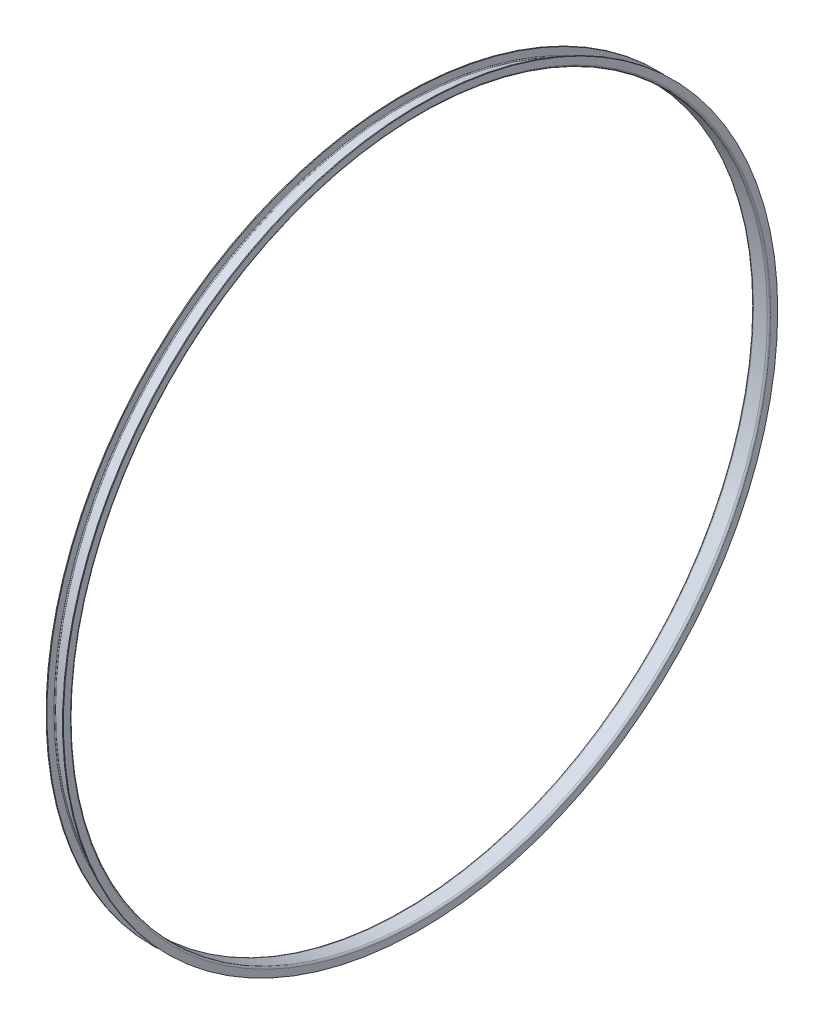
ISO-10303-21;
HEADER;
FILE_DESCRIPTION(('STEP AP214'),'2;1');
FILE_NAME('part.step','',(''),(''),'','','');
FILE_SCHEMA(('AUTOMOTIVE_DESIGN { 1 0 10303 214 1 1 1 1 }'));
ENDSEC;
DATA;
#1=APPLICATION_CONTEXT('core data for automotive mechanical design processes');
#2=APPLICATION_PROTOCOL_DEFINITION('international standard','automotive_design',2000,#1);
#3=PRODUCT_CONTEXT('',#1,'mechanical');
#4=PRODUCT('Part','Part','',(#3));
#5=PRODUCT_RELATED_PRODUCT_CATEGORY('part','',(#4));
#6=PRODUCT_DEFINITION_FORMATION('','',#4);
#7=PRODUCT_DEFINITION_CONTEXT('part definition',#1,'design');
#8=PRODUCT_DEFINITION('design','',#6,#7);
#9=PRODUCT_DEFINITION_SHAPE('','',#8);
#10=(LENGTH_UNIT() NAMED_UNIT(*) SI_UNIT(.MILLI.,.METRE.));
#11=(NAMED_UNIT(*) PLANE_ANGLE_UNIT() SI_UNIT($,.RADIAN.));
#12=(NAMED_UNIT(*) SI_UNIT($,.STERADIAN.) SOLID_ANGLE_UNIT());
#13=UNCERTAINTY_MEASURE_WITH_UNIT(LENGTH_MEASURE(1.E-05),#10,'distance_accuracy_value','');
#14=(GEOMETRIC_REPRESENTATION_CONTEXT(3) GLOBAL_UNCERTAINTY_ASSIGNED_CONTEXT((#13)) GLOBAL_UNIT_ASSIGNED_CONTEXT((#10,
#11,#12)) REPRESENTATION_CONTEXT('',''));
#15=CARTESIAN_POINT('',(0.,0.,0.));
#16=DIRECTION('',(0.,0.,1.));
#17=DIRECTION('',(1.,0.,0.));
#18=AXIS2_PLACEMENT_3D('',#15,#16,#17);
#19=CARTESIAN_POINT('',(63.9444742405727,-749.462809917355,0.));
#20=DIRECTION('',(1.,0.,0.));
#21=DIRECTION('',(0.,0.,-1.));
#22=AXIS2_PLACEMENT_3D('',#19,#20,#21);
#23=CYLINDRICAL_SURFACE('',#22,825.);
#24=CARTESIAN_POINT('',(-38.,-749.462809917355,0.));
#25=DIRECTION('',(1.,0.,0.));
#26=DIRECTION('',(0.,0.,-1.));
#27=AXIS2_PLACEMENT_3D('',#24,#25,#26);
#28=CIRCLE('',#27,825.);
#29=CARTESIAN_POINT('',(-38.,-749.462809917355,-825.));
#30=VERTEX_POINT('',#29);
#31=EDGE_CURVE('E72',#30,#30,#28,.T.);
#32=ORIENTED_EDGE('',*,*,#31,.T.);
#33=EDGE_LOOP('',(#32));
#34=FACE_BOUND('',#33,.T.);
#35=CARTESIAN_POINT('',(-36.,-749.462809917355,0.));
#36=DIRECTION('',(1.,0.,0.));
#37=DIRECTION('',(0.,0.,-1.));
#38=AXIS2_PLACEMENT_3D('',#35,#36,#37);
#39=CIRCLE('',#38,825.);
#40=CARTESIAN_POINT('',(-36.,-749.462809917355,-825.));
#41=VERTEX_POINT('',#40);
#42=EDGE_CURVE('E10',#41,#41,#39,.T.);
#43=ORIENTED_EDGE('',*,*,#42,.F.);
#44=EDGE_LOOP('',(#43));
#45=FACE_BOUND('',#44,.T.);
#46=ADVANCED_FACE('F32',(#34,#45),#23,.T.);
#47=CARTESIAN_POINT('',(-36.,59.5371900826446,0.));
#48=DIRECTION('',(1.,0.,0.));
#49=DIRECTION('',(0.,0.,-1.));
#50=AXIS2_PLACEMENT_3D('',#47,#48,#49);
#51=PLANE('',#50);
#52=ORIENTED_EDGE('',*,*,#42,.T.);
#53=EDGE_LOOP('',(#52));
#54=FACE_BOUND('',#53,.T.);
#55=CARTESIAN_POINT('',(-36.,-749.462809917355,0.));
#56=DIRECTION('',(1.,0.,0.));
#57=DIRECTION('',(0.,0.,-1.));
#58=AXIS2_PLACEMENT_3D('',#55,#56,#57);
#59=CIRCLE('',#58,809.);
#60=CARTESIAN_POINT('',(-36.,-749.462809917355,-809.));
#61=VERTEX_POINT('',#60);
#62=EDGE_CURVE('E38',#61,#61,#59,.T.);
#63=ORIENTED_EDGE('',*,*,#62,.F.);
#64=EDGE_LOOP('',(#63));
#65=FACE_BOUND('',#64,.T.);
#66=ADVANCED_FACE('F90',(#54,#65),#51,.T.);
#67=CARTESIAN_POINT('',(-34.,-749.462809917355,0.));
#68=DIRECTION('',(1.,0.,0.));
#69=DIRECTION('',(0.,0.,-1.));
#70=AXIS2_PLACEMENT_3D('',#67,#68,#69);
#71=TOROIDAL_SURFACE('',#70,809.,2.);
#72=ORIENTED_EDGE('',*,*,#62,.T.);
#73=EDGE_LOOP('',(#72));
#74=FACE_BOUND('',#73,.T.);
#75=CARTESIAN_POINT('',(-34.,-749.462809917355,0.));
#76=DIRECTION('',(1.,0.,0.));
#77=DIRECTION('',(0.,0.,-1.));
#78=AXIS2_PLACEMENT_3D('',#75,#76,#77);
#79=CIRCLE('',#78,807.);
#80=CARTESIAN_POINT('',(-34.,-749.462809917355,-807.));
#81=VERTEX_POINT('',#80);
#82=EDGE_CURVE('E42',#81,#81,#79,.T.);
#83=ORIENTED_EDGE('',*,*,#82,.F.);
#84=EDGE_LOOP('',(#83));
#85=FACE_BOUND('',#84,.T.);
#86=ADVANCED_FACE('F94',(#74,#85),#71,.F.);
#87=CARTESIAN_POINT('',(63.9444742405727,-749.462809917355,0.));
#88=DIRECTION('',(1.,0.,0.));
#89=DIRECTION('',(0.,0.,-1.));
#90=AXIS2_PLACEMENT_3D('',#87,#88,#89);
#91=CYLINDRICAL_SURFACE('',#90,807.);
#92=ORIENTED_EDGE('',*,*,#82,.T.);
#93=EDGE_LOOP('',(#92));
#94=FACE_BOUND('',#93,.T.);
#95=CARTESIAN_POINT('',(-2.00000000000002,-749.462809917355,0.));
#96=DIRECTION('',(1.,0.,0.));
#97=DIRECTION('',(0.,0.,-1.));
#98=AXIS2_PLACEMENT_3D('',#95,#96,#97);
#99=CIRCLE('',#98,807.);
#100=CARTESIAN_POINT('',(-2.00000000000002,-749.462809917355,-807.));
#101=VERTEX_POINT('',#100);
#102=EDGE_CURVE('E46',#101,#101,#99,.T.);
#103=ORIENTED_EDGE('',*,*,#102,.F.);
#104=EDGE_LOOP('',(#103));
#105=FACE_BOUND('',#104,.T.);
#106=ADVANCED_FACE('F98',(#94,#105),#91,.T.);
#107=CARTESIAN_POINT('',(-2.,-749.462809917355,0.));
#108=DIRECTION('',(1.,0.,0.));
#109=DIRECTION('',(0.,0.,-1.));
#110=AXIS2_PLACEMENT_3D('',#107,#108,#109);
#111=TOROIDAL_SURFACE('',#110,809.,2.);
#112=ORIENTED_EDGE('',*,*,#102,.T.);
#113=EDGE_LOOP('',(#112));
#114=FACE_BOUND('',#113,.T.);
#115=CARTESIAN_POINT('',(0.,-749.462809917355,0.));
#116=DIRECTION('',(1.,0.,0.));
#117=DIRECTION('',(0.,0.,-1.));
#118=AXIS2_PLACEMENT_3D('',#115,#116,#117);
#119=CIRCLE('',#118,809.);
#120=CARTESIAN_POINT('',(0.,-749.462809917355,-809.));
#121=VERTEX_POINT('',#120);
#122=EDGE_CURVE('E51',#121,#121,#119,.T.);
#123=ORIENTED_EDGE('',*,*,#122,.F.);
#124=EDGE_LOOP('',(#123));
#125=FACE_BOUND('',#124,.T.);
#126=ADVANCED_FACE('F104',(#114,#125),#111,.F.);
#127=CARTESIAN_POINT('',(0.,75.5371900826446,0.));
#128=DIRECTION('',(-1.,0.,0.));
#129=DIRECTION('',(0.,0.,1.));
#130=AXIS2_PLACEMENT_3D('',#127,#128,#129);
#131=PLANE('',#130);
#132=ORIENTED_EDGE('',*,*,#122,.T.);
#133=EDGE_LOOP('',(#132));
#134=FACE_BOUND('',#133,.T.);
#135=CARTESIAN_POINT('',(0.,-749.462809917355,0.));
#136=DIRECTION('',(1.,0.,0.));
#137=DIRECTION('',(0.,0.,-1.));
#138=AXIS2_PLACEMENT_3D('',#135,#136,#137);
#139=CIRCLE('',#138,825.);
#140=CARTESIAN_POINT('',(0.,-749.462809917355,-825.));
#141=VERTEX_POINT('',#140);
#142=EDGE_CURVE('E54',#141,#141,#139,.T.);
#143=ORIENTED_EDGE('',*,*,#142,.F.);
#144=EDGE_LOOP('',(#143));
#145=FACE_BOUND('',#144,.T.);
#146=ADVANCED_FACE('F108',(#134,#145),#131,.T.);
#147=CARTESIAN_POINT('',(63.9444742405727,-749.462809917355,0.));
#148=DIRECTION('',(1.,0.,0.));
#149=DIRECTION('',(0.,0.,-1.));
#150=AXIS2_PLACEMENT_3D('',#147,#148,#149);
#151=CYLINDRICAL_SURFACE('',#150,825.);
#152=ORIENTED_EDGE('',*,*,#142,.T.);
#153=EDGE_LOOP('',(#152));
#154=FACE_BOUND('',#153,.T.);
#155=CARTESIAN_POINT('',(2.,-749.462809917355,0.));
#156=DIRECTION('',(1.,0.,0.));
#157=DIRECTION('',(0.,0.,-1.));
#158=AXIS2_PLACEMENT_3D('',#155,#156,#157);
#159=CIRCLE('',#158,825.);
#160=CARTESIAN_POINT('',(2.,-749.462809917355,-825.));
#161=VERTEX_POINT('',#160);
#162=EDGE_CURVE('E57',#161,#161,#159,.T.);
#163=ORIENTED_EDGE('',*,*,#162,.F.);
#164=EDGE_LOOP('',(#163));
#165=FACE_BOUND('',#164,.T.);
#166=ADVANCED_FACE('F112',(#154,#165),#151,.T.);
#167=CARTESIAN_POINT('',(2.,59.5371900826447,0.));
#168=DIRECTION('',(1.,0.,0.));
#169=DIRECTION('',(0.,0.,-1.));
#170=AXIS2_PLACEMENT_3D('',#167,#168,#169);
#171=PLANE('',#170);
#172=ORIENTED_EDGE('',*,*,#162,.T.);
#173=EDGE_LOOP('',(#172));
#174=FACE_BOUND('',#173,.T.);
#175=CARTESIAN_POINT('',(2.,-749.462809917355,0.));
#176=DIRECTION('',(1.,0.,0.));
#177=DIRECTION('',(0.,0.,-1.));
#178=AXIS2_PLACEMENT_3D('',#175,#176,#177);
#179=CIRCLE('',#178,809.);
#180=CARTESIAN_POINT('',(2.,-749.462809917355,-809.));
#181=VERTEX_POINT('',#180);
#182=EDGE_CURVE('E60',#181,#181,#179,.T.);
#183=ORIENTED_EDGE('',*,*,#182,.F.);
#184=EDGE_LOOP('',(#183));
#185=FACE_BOUND('',#184,.T.);
#186=ADVANCED_FACE('F116',(#174,#185),#171,.T.);
#187=CARTESIAN_POINT('',(-2.,-749.462809917355,0.));
#188=DIRECTION('',(1.,0.,0.));
#189=DIRECTION('',(0.,0.,-1.));
#190=AXIS2_PLACEMENT_3D('',#187,#188,#189);
#191=TOROIDAL_SURFACE('',#190,809.,4.);
#192=ORIENTED_EDGE('',*,*,#182,.T.);
#193=EDGE_LOOP('',(#192));
#194=FACE_BOUND('',#193,.T.);
#195=CARTESIAN_POINT('',(-2.00000000000003,-749.462809917355,0.));
#196=DIRECTION('',(1.,0.,0.));
#197=DIRECTION('',(0.,0.,-1.));
#198=AXIS2_PLACEMENT_3D('',#195,#196,#197);
#199=CIRCLE('',#198,805.);
#200=CARTESIAN_POINT('',(-2.00000000000003,-749.462809917355,-805.));
#201=VERTEX_POINT('',#200);
#202=EDGE_CURVE('E63',#201,#201,#199,.T.);
#203=ORIENTED_EDGE('',*,*,#202,.F.);
#204=EDGE_LOOP('',(#203));
#205=FACE_BOUND('',#204,.T.);
#206=ADVANCED_FACE('F120',(#194,#205),#191,.T.);
#207=CARTESIAN_POINT('',(63.9444742405727,-749.462809917355,0.));
#208=DIRECTION('',(1.,0.,0.));
#209=DIRECTION('',(0.,0.,-1.));
#210=AXIS2_PLACEMENT_3D('',#207,#208,#209);
#211=CYLINDRICAL_SURFACE('',#210,805.);
#212=ORIENTED_EDGE('',*,*,#202,.T.);
#213=EDGE_LOOP('',(#212));
#214=FACE_BOUND('',#213,.T.);
#215=CARTESIAN_POINT('',(-34.,-749.462809917355,0.));
#216=DIRECTION('',(1.,0.,0.));
#217=DIRECTION('',(0.,0.,-1.));
#218=AXIS2_PLACEMENT_3D('',#215,#216,#217);
#219=CIRCLE('',#218,805.);
#220=CARTESIAN_POINT('',(-34.,-749.462809917355,-805.));
#221=VERTEX_POINT('',#220);
#222=EDGE_CURVE('E66',#221,#221,#219,.T.);
#223=ORIENTED_EDGE('',*,*,#222,.F.);
#224=EDGE_LOOP('',(#223));
#225=FACE_BOUND('',#224,.T.);
#226=ADVANCED_FACE('F86',(#214,#225),#211,.F.);
#227=CARTESIAN_POINT('',(-34.,-749.462809917355,0.));
#228=DIRECTION('',(1.,0.,0.));
#229=DIRECTION('',(0.,0.,-1.));
#230=AXIS2_PLACEMENT_3D('',#227,#228,#229);
#231=TOROIDAL_SURFACE('',#230,809.,4.);
#232=ORIENTED_EDGE('',*,*,#222,.T.);
#233=EDGE_LOOP('',(#232));
#234=FACE_BOUND('',#233,.T.);
#235=CARTESIAN_POINT('',(-38.,-749.462809917355,0.));
#236=DIRECTION('',(1.,0.,0.));
#237=DIRECTION('',(0.,0.,-1.));
#238=AXIS2_PLACEMENT_3D('',#235,#236,#237);
#239=CIRCLE('',#238,809.);
#240=CARTESIAN_POINT('',(-38.,-749.462809917355,-809.));
#241=VERTEX_POINT('',#240);
#242=EDGE_CURVE('E69',#241,#241,#239,.T.);
#243=ORIENTED_EDGE('',*,*,#242,.F.);
#244=EDGE_LOOP('',(#243));
#245=FACE_BOUND('',#244,.T.);
#246=ADVANCED_FACE('F80',(#234,#245),#231,.T.);
#247=CARTESIAN_POINT('',(-38.,75.5371900826446,0.));
#248=DIRECTION('',(-1.,0.,0.));
#249=DIRECTION('',(0.,0.,1.));
#250=AXIS2_PLACEMENT_3D('',#247,#248,#249);
#251=PLANE('',#250);
#252=ORIENTED_EDGE('',*,*,#242,.T.);
#253=EDGE_LOOP('',(#252));
#254=FACE_BOUND('',#253,.T.);
#255=ORIENTED_EDGE('',*,*,#31,.F.);
#256=EDGE_LOOP('',(#255));
#257=FACE_BOUND('',#256,.T.);
#258=ADVANCED_FACE('F78',(#254,#257),#251,.T.);
#259=CLOSED_SHELL('',(#46,#66,#86,#106,#126,#146,#166,#186,#206,#226,#246,#258));
#260=MANIFOLD_SOLID_BREP('B2',#259);
#261=ADVANCED_BREP_SHAPE_REPRESENTATION('',(#18,#260),#14);
#262=SHAPE_DEFINITION_REPRESENTATION(#9,#261);
ENDSEC;
END-ISO-10303-21;
